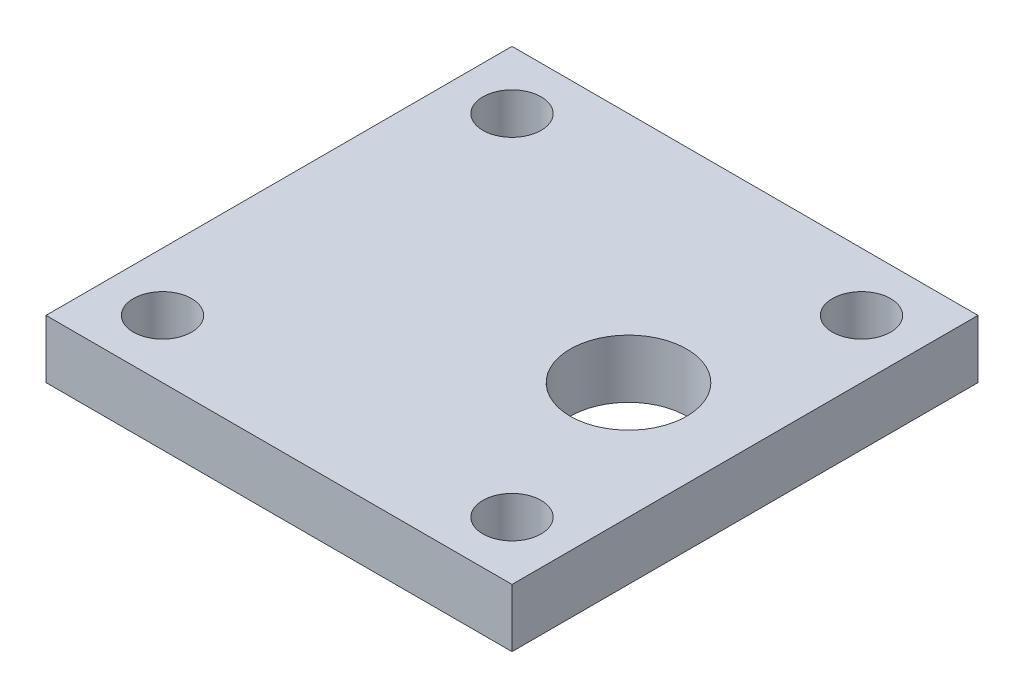
ISO-10303-21;
HEADER;
FILE_DESCRIPTION(('STEP AP214'),'2;1');
FILE_NAME('part.step','',(''),(''),'','','');
FILE_SCHEMA(('AUTOMOTIVE_DESIGN { 1 0 10303 214 1 1 1 1 }'));
ENDSEC;
DATA;
#1=APPLICATION_CONTEXT('core data for automotive mechanical design processes');
#2=APPLICATION_PROTOCOL_DEFINITION('international standard','automotive_design',2000,#1);
#3=PRODUCT_CONTEXT('',#1,'mechanical');
#4=PRODUCT('Part','Part','',(#3));
#5=PRODUCT_RELATED_PRODUCT_CATEGORY('part','',(#4));
#6=PRODUCT_DEFINITION_FORMATION('','',#4);
#7=PRODUCT_DEFINITION_CONTEXT('part definition',#1,'design');
#8=PRODUCT_DEFINITION('design','',#6,#7);
#9=PRODUCT_DEFINITION_SHAPE('','',#8);
#10=(LENGTH_UNIT() NAMED_UNIT(*) SI_UNIT(.MILLI.,.METRE.));
#11=(NAMED_UNIT(*) PLANE_ANGLE_UNIT() SI_UNIT($,.RADIAN.));
#12=(NAMED_UNIT(*) SI_UNIT($,.STERADIAN.) SOLID_ANGLE_UNIT());
#13=UNCERTAINTY_MEASURE_WITH_UNIT(LENGTH_MEASURE(1.E-05),#10,'distance_accuracy_value','');
#14=(GEOMETRIC_REPRESENTATION_CONTEXT(3) GLOBAL_UNCERTAINTY_ASSIGNED_CONTEXT((#13)) GLOBAL_UNIT_ASSIGNED_CONTEXT((#10,
#11,#12)) REPRESENTATION_CONTEXT('',''));
#15=CARTESIAN_POINT('',(0.,0.,0.));
#16=DIRECTION('',(0.,0.,1.));
#17=DIRECTION('',(1.,0.,0.));
#18=AXIS2_PLACEMENT_3D('',#15,#16,#17);
#19=CARTESIAN_POINT('',(0.,12.7,0.));
#20=DIRECTION('',(0.,1.,0.));
#21=DIRECTION('',(0.,0.,1.));
#22=AXIS2_PLACEMENT_3D('',#19,#20,#21);
#23=PLANE('',#22);
#24=CARTESIAN_POINT('',(25.4,12.7,0.));
#25=DIRECTION('',(0.,1.,0.));
#26=DIRECTION('',(0.,0.,1.));
#27=AXIS2_PLACEMENT_3D('',#24,#25,#26);
#28=CIRCLE('',#27,12.7);
#29=CARTESIAN_POINT('',(25.4,12.7,12.7));
#30=VERTEX_POINT('',#29);
#31=EDGE_CURVE('E94',#30,#30,#28,.F.);
#32=ORIENTED_EDGE('',*,*,#31,.T.);
#33=EDGE_LOOP('',(#32));
#34=FACE_BOUND('',#33,.T.);
#35=CARTESIAN_POINT('',(38.1,12.7,-38.1));
#36=DIRECTION('',(0.,1.,0.));
#37=DIRECTION('',(0.,0.,1.));
#38=AXIS2_PLACEMENT_3D('',#35,#36,#37);
#39=CIRCLE('',#38,6.35);
#40=CARTESIAN_POINT('',(38.1,12.7,-31.75));
#41=VERTEX_POINT('',#40);
#42=EDGE_CURVE('E97',#41,#41,#39,.F.);
#43=ORIENTED_EDGE('',*,*,#42,.T.);
#44=EDGE_LOOP('',(#43));
#45=FACE_BOUND('',#44,.T.);
#46=CARTESIAN_POINT('',(38.1,12.7,38.1));
#47=DIRECTION('',(0.,1.,0.));
#48=DIRECTION('',(0.,0.,1.));
#49=AXIS2_PLACEMENT_3D('',#46,#47,#48);
#50=CIRCLE('',#49,6.35);
#51=CARTESIAN_POINT('',(38.1,12.7,44.45));
#52=VERTEX_POINT('',#51);
#53=EDGE_CURVE('E100',#52,#52,#50,.F.);
#54=ORIENTED_EDGE('',*,*,#53,.T.);
#55=EDGE_LOOP('',(#54));
#56=FACE_BOUND('',#55,.T.);
#57=CARTESIAN_POINT('',(-38.1,12.7,38.1));
#58=DIRECTION('',(0.,1.,0.));
#59=DIRECTION('',(0.,0.,1.));
#60=AXIS2_PLACEMENT_3D('',#57,#58,#59);
#61=CIRCLE('',#60,6.35);
#62=CARTESIAN_POINT('',(-38.1,12.7,44.45));
#63=VERTEX_POINT('',#62);
#64=EDGE_CURVE('E102',#63,#63,#61,.F.);
#65=ORIENTED_EDGE('',*,*,#64,.T.);
#66=EDGE_LOOP('',(#65));
#67=FACE_BOUND('',#66,.T.);
#68=CARTESIAN_POINT('',(-38.1,12.7,-38.1));
#69=DIRECTION('',(0.,1.,0.));
#70=DIRECTION('',(0.,0.,1.));
#71=AXIS2_PLACEMENT_3D('',#68,#69,#70);
#72=CIRCLE('',#71,6.35);
#73=CARTESIAN_POINT('',(-38.1,12.7,-31.75));
#74=VERTEX_POINT('',#73);
#75=EDGE_CURVE('E19',#74,#74,#72,.F.);
#76=ORIENTED_EDGE('',*,*,#75,.T.);
#77=EDGE_LOOP('',(#76));
#78=FACE_BOUND('',#77,.T.);
#79=DIRECTION('',(-1.,0.,0.));
#80=VECTOR('',#79,1.);
#81=CARTESIAN_POINT('',(50.8,12.7,-50.8));
#82=LINE('',#81,#80);
#83=CARTESIAN_POINT('',(-50.8,12.7,-50.8));
#84=VERTEX_POINT('',#83);
#85=CARTESIAN_POINT('',(50.8,12.7,-50.8));
#86=VERTEX_POINT('',#85);
#87=EDGE_CURVE('E70',#84,#86,#82,.F.);
#88=ORIENTED_EDGE('',*,*,#87,.F.);
#89=DIRECTION('',(0.,0.,1.));
#90=VECTOR('',#89,1.);
#91=CARTESIAN_POINT('',(-50.8,12.7,-50.8));
#92=LINE('',#91,#90);
#93=CARTESIAN_POINT('',(-50.8,12.7,50.8));
#94=VERTEX_POINT('',#93);
#95=EDGE_CURVE('E67',#94,#84,#92,.F.);
#96=ORIENTED_EDGE('',*,*,#95,.F.);
#97=DIRECTION('',(1.,0.,0.));
#98=VECTOR('',#97,1.);
#99=CARTESIAN_POINT('',(-50.8,12.7,50.8));
#100=LINE('',#99,#98);
#101=CARTESIAN_POINT('',(50.8,12.7,50.8));
#102=VERTEX_POINT('',#101);
#103=EDGE_CURVE('E58',#102,#94,#100,.F.);
#104=ORIENTED_EDGE('',*,*,#103,.F.);
#105=DIRECTION('',(0.,0.,-1.));
#106=VECTOR('',#105,1.);
#107=CARTESIAN_POINT('',(50.8,12.7,50.8));
#108=LINE('',#107,#106);
#109=EDGE_CURVE('E53',#86,#102,#108,.F.);
#110=ORIENTED_EDGE('',*,*,#109,.F.);
#111=EDGE_LOOP('',(#88,#96,#104,#110));
#112=FACE_BOUND('',#111,.T.);
#113=ADVANCED_FACE('F16',(#34,#45,#56,#67,#78,#112),#23,.T.);
#114=CARTESIAN_POINT('',(-50.8,0.,-50.8));
#115=DIRECTION('',(-1.,0.,0.));
#116=DIRECTION('',(0.,0.,1.));
#117=AXIS2_PLACEMENT_3D('',#114,#115,#116);
#118=PLANE('',#117);
#119=DIRECTION('',(0.,1.,0.));
#120=VECTOR('',#119,1.);
#121=CARTESIAN_POINT('',(-50.8,0.,-50.8));
#122=LINE('',#121,#120);
#123=CARTESIAN_POINT('',(-50.8,0.,-50.8));
#124=VERTEX_POINT('',#123);
#125=EDGE_CURVE('E110',#124,#84,#122,.T.);
#126=ORIENTED_EDGE('',*,*,#125,.F.);
#127=DIRECTION('',(0.,0.,1.));
#128=VECTOR('',#127,1.);
#129=CARTESIAN_POINT('',(-50.8,0.,0.));
#130=LINE('',#129,#128);
#131=CARTESIAN_POINT('',(-50.8,0.,50.8));
#132=VERTEX_POINT('',#131);
#133=EDGE_CURVE('E77',#124,#132,#130,.T.);
#134=ORIENTED_EDGE('',*,*,#133,.T.);
#135=DIRECTION('',(0.,1.,0.));
#136=VECTOR('',#135,1.);
#137=CARTESIAN_POINT('',(-50.8,0.,50.8));
#138=LINE('',#137,#136);
#139=EDGE_CURVE('E63',#94,#132,#138,.F.);
#140=ORIENTED_EDGE('',*,*,#139,.F.);
#141=ORIENTED_EDGE('',*,*,#95,.T.);
#142=EDGE_LOOP('',(#126,#134,#140,#141));
#143=FACE_BOUND('',#142,.T.);
#144=ADVANCED_FACE('F76',(#143),#118,.T.);
#145=CARTESIAN_POINT('',(-50.8,0.,50.8));
#146=DIRECTION('',(0.,0.,1.));
#147=DIRECTION('',(1.,0.,0.));
#148=AXIS2_PLACEMENT_3D('',#145,#146,#147);
#149=PLANE('',#148);
#150=ORIENTED_EDGE('',*,*,#139,.T.);
#151=DIRECTION('',(1.,0.,0.));
#152=VECTOR('',#151,1.);
#153=CARTESIAN_POINT('',(0.,0.,50.8));
#154=LINE('',#153,#152);
#155=CARTESIAN_POINT('',(50.8,0.,50.8));
#156=VERTEX_POINT('',#155);
#157=EDGE_CURVE('E121',#132,#156,#154,.T.);
#158=ORIENTED_EDGE('',*,*,#157,.T.);
#159=DIRECTION('',(0.,1.,0.));
#160=VECTOR('',#159,1.);
#161=CARTESIAN_POINT('',(50.8,0.,50.8));
#162=LINE('',#161,#160);
#163=EDGE_CURVE('E65',#102,#156,#162,.F.);
#164=ORIENTED_EDGE('',*,*,#163,.F.);
#165=ORIENTED_EDGE('',*,*,#103,.T.);
#166=EDGE_LOOP('',(#150,#158,#164,#165));
#167=FACE_BOUND('',#166,.T.);
#168=ADVANCED_FACE('F60',(#167),#149,.T.);
#169=CARTESIAN_POINT('',(50.8,0.,50.8));
#170=DIRECTION('',(1.,0.,0.));
#171=DIRECTION('',(0.,0.,-1.));
#172=AXIS2_PLACEMENT_3D('',#169,#170,#171);
#173=PLANE('',#172);
#174=ORIENTED_EDGE('',*,*,#163,.T.);
#175=DIRECTION('',(0.,0.,1.));
#176=VECTOR('',#175,1.);
#177=CARTESIAN_POINT('',(50.8,0.,0.));
#178=LINE('',#177,#176);
#179=CARTESIAN_POINT('',(50.8,0.,-50.8));
#180=VERTEX_POINT('',#179);
#181=EDGE_CURVE('E118',#156,#180,#178,.F.);
#182=ORIENTED_EDGE('',*,*,#181,.T.);
#183=DIRECTION('',(0.,1.,0.));
#184=VECTOR('',#183,1.);
#185=CARTESIAN_POINT('',(50.8,0.,-50.8));
#186=LINE('',#185,#184);
#187=EDGE_CURVE('E34',#86,#180,#186,.F.);
#188=ORIENTED_EDGE('',*,*,#187,.F.);
#189=ORIENTED_EDGE('',*,*,#109,.T.);
#190=EDGE_LOOP('',(#174,#182,#188,#189));
#191=FACE_BOUND('',#190,.T.);
#192=ADVANCED_FACE('F117',(#191),#173,.T.);
#193=CARTESIAN_POINT('',(50.8,0.,-50.8));
#194=DIRECTION('',(0.,0.,-1.));
#195=DIRECTION('',(-1.,0.,0.));
#196=AXIS2_PLACEMENT_3D('',#193,#194,#195);
#197=PLANE('',#196);
#198=ORIENTED_EDGE('',*,*,#187,.T.);
#199=DIRECTION('',(1.,0.,0.));
#200=VECTOR('',#199,1.);
#201=CARTESIAN_POINT('',(0.,0.,-50.8));
#202=LINE('',#201,#200);
#203=EDGE_CURVE('E93',#180,#124,#202,.F.);
#204=ORIENTED_EDGE('',*,*,#203,.T.);
#205=ORIENTED_EDGE('',*,*,#125,.T.);
#206=ORIENTED_EDGE('',*,*,#87,.T.);
#207=EDGE_LOOP('',(#198,#204,#205,#206));
#208=FACE_BOUND('',#207,.T.);
#209=ADVANCED_FACE('F124',(#208),#197,.T.);
#210=CARTESIAN_POINT('',(-38.1,12.7,-38.1));
#211=DIRECTION('',(0.,1.,0.));
#212=DIRECTION('',(0.,0.,1.));
#213=AXIS2_PLACEMENT_3D('',#210,#211,#212);
#214=CYLINDRICAL_SURFACE('',#213,6.35);
#215=ORIENTED_EDGE('',*,*,#75,.F.);
#216=EDGE_LOOP('',(#215));
#217=FACE_BOUND('',#216,.T.);
#218=CARTESIAN_POINT('',(-38.1,0.,-38.1));
#219=DIRECTION('',(0.,1.,0.));
#220=DIRECTION('',(0.,0.,1.));
#221=AXIS2_PLACEMENT_3D('',#218,#219,#220);
#222=CIRCLE('',#221,6.35);
#223=CARTESIAN_POINT('',(-38.1,0.,-31.75));
#224=VERTEX_POINT('',#223);
#225=EDGE_CURVE('E90',#224,#224,#222,.F.);
#226=ORIENTED_EDGE('',*,*,#225,.T.);
#227=EDGE_LOOP('',(#226));
#228=FACE_BOUND('',#227,.T.);
#229=ADVANCED_FACE('F126',(#217,#228),#214,.F.);
#230=CARTESIAN_POINT('',(-38.1,12.7,38.1));
#231=DIRECTION('',(0.,1.,0.));
#232=DIRECTION('',(0.,0.,1.));
#233=AXIS2_PLACEMENT_3D('',#230,#231,#232);
#234=CYLINDRICAL_SURFACE('',#233,6.35);
#235=ORIENTED_EDGE('',*,*,#64,.F.);
#236=EDGE_LOOP('',(#235));
#237=FACE_BOUND('',#236,.T.);
#238=CARTESIAN_POINT('',(-38.1,0.,38.1));
#239=DIRECTION('',(0.,1.,0.));
#240=DIRECTION('',(0.,0.,1.));
#241=AXIS2_PLACEMENT_3D('',#238,#239,#240);
#242=CIRCLE('',#241,6.35);
#243=CARTESIAN_POINT('',(-38.1,0.,44.45));
#244=VERTEX_POINT('',#243);
#245=EDGE_CURVE('E87',#244,#244,#242,.F.);
#246=ORIENTED_EDGE('',*,*,#245,.T.);
#247=EDGE_LOOP('',(#246));
#248=FACE_BOUND('',#247,.T.);
#249=ADVANCED_FACE('F133',(#237,#248),#234,.F.);
#250=CARTESIAN_POINT('',(38.1,12.7,38.1));
#251=DIRECTION('',(0.,1.,0.));
#252=DIRECTION('',(0.,0.,1.));
#253=AXIS2_PLACEMENT_3D('',#250,#251,#252);
#254=CYLINDRICAL_SURFACE('',#253,6.35);
#255=ORIENTED_EDGE('',*,*,#53,.F.);
#256=EDGE_LOOP('',(#255));
#257=FACE_BOUND('',#256,.T.);
#258=CARTESIAN_POINT('',(38.1,0.,38.1));
#259=DIRECTION('',(0.,1.,0.));
#260=DIRECTION('',(0.,0.,1.));
#261=AXIS2_PLACEMENT_3D('',#258,#259,#260);
#262=CIRCLE('',#261,6.35);
#263=CARTESIAN_POINT('',(38.1,0.,44.45));
#264=VERTEX_POINT('',#263);
#265=EDGE_CURVE('E84',#264,#264,#262,.F.);
#266=ORIENTED_EDGE('',*,*,#265,.T.);
#267=EDGE_LOOP('',(#266));
#268=FACE_BOUND('',#267,.T.);
#269=ADVANCED_FACE('F152',(#257,#268),#254,.F.);
#270=CARTESIAN_POINT('',(38.1,12.7,-38.1));
#271=DIRECTION('',(0.,1.,0.));
#272=DIRECTION('',(0.,0.,1.));
#273=AXIS2_PLACEMENT_3D('',#270,#271,#272);
#274=CYLINDRICAL_SURFACE('',#273,6.35);
#275=ORIENTED_EDGE('',*,*,#42,.F.);
#276=EDGE_LOOP('',(#275));
#277=FACE_BOUND('',#276,.T.);
#278=CARTESIAN_POINT('',(38.1,0.,-38.1));
#279=DIRECTION('',(0.,1.,0.));
#280=DIRECTION('',(0.,0.,1.));
#281=AXIS2_PLACEMENT_3D('',#278,#279,#280);
#282=CIRCLE('',#281,6.35);
#283=CARTESIAN_POINT('',(38.1,0.,-31.75));
#284=VERTEX_POINT('',#283);
#285=EDGE_CURVE('E25',#284,#284,#282,.F.);
#286=ORIENTED_EDGE('',*,*,#285,.T.);
#287=EDGE_LOOP('',(#286));
#288=FACE_BOUND('',#287,.T.);
#289=ADVANCED_FACE('F144',(#277,#288),#274,.F.);
#290=CARTESIAN_POINT('',(25.4,12.7,0.));
#291=DIRECTION('',(0.,1.,0.));
#292=DIRECTION('',(0.,0.,1.));
#293=AXIS2_PLACEMENT_3D('',#290,#291,#292);
#294=CYLINDRICAL_SURFACE('',#293,12.7);
#295=ORIENTED_EDGE('',*,*,#31,.F.);
#296=EDGE_LOOP('',(#295));
#297=FACE_BOUND('',#296,.T.);
#298=CARTESIAN_POINT('',(25.4,0.,0.));
#299=DIRECTION('',(0.,1.,0.));
#300=DIRECTION('',(0.,0.,1.));
#301=AXIS2_PLACEMENT_3D('',#298,#299,#300);
#302=CIRCLE('',#301,12.7);
#303=CARTESIAN_POINT('',(25.4,0.,12.7));
#304=VERTEX_POINT('',#303);
#305=EDGE_CURVE('E11',#304,#304,#302,.F.);
#306=ORIENTED_EDGE('',*,*,#305,.T.);
#307=EDGE_LOOP('',(#306));
#308=FACE_BOUND('',#307,.T.);
#309=ADVANCED_FACE('F138',(#297,#308),#294,.F.);
#310=CARTESIAN_POINT('',(0.,0.,0.));
#311=DIRECTION('',(0.,1.,0.));
#312=DIRECTION('',(0.,0.,1.));
#313=AXIS2_PLACEMENT_3D('',#310,#311,#312);
#314=PLANE('',#313);
#315=ORIENTED_EDGE('',*,*,#305,.F.);
#316=EDGE_LOOP('',(#315));
#317=FACE_BOUND('',#316,.T.);
#318=ORIENTED_EDGE('',*,*,#285,.F.);
#319=EDGE_LOOP('',(#318));
#320=FACE_BOUND('',#319,.T.);
#321=ORIENTED_EDGE('',*,*,#265,.F.);
#322=EDGE_LOOP('',(#321));
#323=FACE_BOUND('',#322,.T.);
#324=ORIENTED_EDGE('',*,*,#245,.F.);
#325=EDGE_LOOP('',(#324));
#326=FACE_BOUND('',#325,.T.);
#327=ORIENTED_EDGE('',*,*,#225,.F.);
#328=EDGE_LOOP('',(#327));
#329=FACE_BOUND('',#328,.T.);
#330=ORIENTED_EDGE('',*,*,#181,.F.);
#331=ORIENTED_EDGE('',*,*,#157,.F.);
#332=ORIENTED_EDGE('',*,*,#133,.F.);
#333=ORIENTED_EDGE('',*,*,#203,.F.);
#334=EDGE_LOOP('',(#330,#331,#332,#333));
#335=FACE_BOUND('',#334,.T.);
#336=ADVANCED_FACE('F120',(#317,#320,#323,#326,#329,#335),#314,.F.);
#337=CLOSED_SHELL('',(#113,#144,#168,#192,#209,#229,#249,#269,#289,#309,#336));
#338=MANIFOLD_SOLID_BREP('B1',#337);
#339=ADVANCED_BREP_SHAPE_REPRESENTATION('',(#18,#338),#14);
#340=SHAPE_DEFINITION_REPRESENTATION(#9,#339);
ENDSEC;
END-ISO-10303-21;
